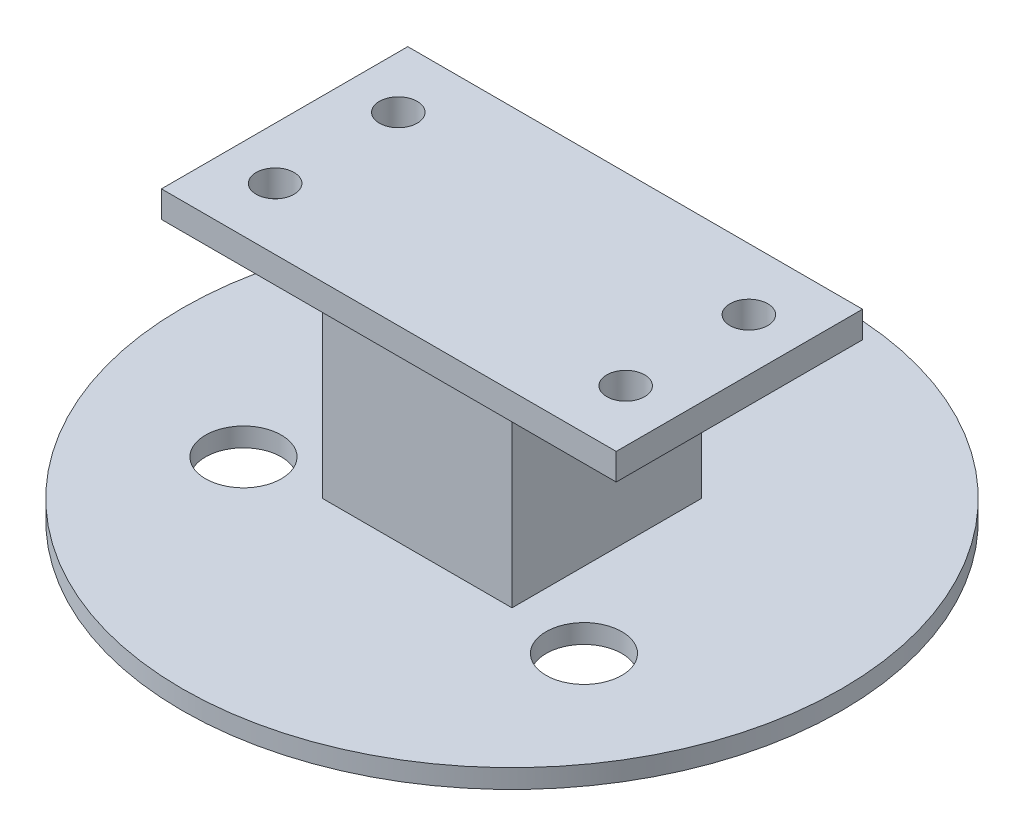
ISO-10303-21;
HEADER;
FILE_DESCRIPTION(('STEP AP214'),'2;1');
FILE_NAME('part.step','',(''),(''),'','','');
FILE_SCHEMA(('AUTOMOTIVE_DESIGN { 1 0 10303 214 1 1 1 1 }'));
ENDSEC;
DATA;
#1=APPLICATION_CONTEXT('core data for automotive mechanical design processes');
#2=APPLICATION_PROTOCOL_DEFINITION('international standard','automotive_design',2000,#1);
#3=PRODUCT_CONTEXT('',#1,'mechanical');
#4=PRODUCT('Part','Part','',(#3));
#5=PRODUCT_RELATED_PRODUCT_CATEGORY('part','',(#4));
#6=PRODUCT_DEFINITION_FORMATION('','',#4);
#7=PRODUCT_DEFINITION_CONTEXT('part definition',#1,'design');
#8=PRODUCT_DEFINITION('design','',#6,#7);
#9=PRODUCT_DEFINITION_SHAPE('','',#8);
#10=(LENGTH_UNIT() NAMED_UNIT(*) SI_UNIT(.MILLI.,.METRE.));
#11=(NAMED_UNIT(*) PLANE_ANGLE_UNIT() SI_UNIT($,.RADIAN.));
#12=(NAMED_UNIT(*) SI_UNIT($,.STERADIAN.) SOLID_ANGLE_UNIT());
#13=UNCERTAINTY_MEASURE_WITH_UNIT(LENGTH_MEASURE(1.E-05),#10,'distance_accuracy_value','');
#14=(GEOMETRIC_REPRESENTATION_CONTEXT(3) GLOBAL_UNCERTAINTY_ASSIGNED_CONTEXT((#13)) GLOBAL_UNIT_ASSIGNED_CONTEXT((#10,
#11,#12)) REPRESENTATION_CONTEXT('',''));
#15=CARTESIAN_POINT('',(0.,0.,0.));
#16=DIRECTION('',(0.,0.,1.));
#17=DIRECTION('',(1.,0.,0.));
#18=AXIS2_PLACEMENT_3D('',#15,#16,#17);
#19=CARTESIAN_POINT('',(0.,5.,0.));
#20=DIRECTION('',(0.,1.,0.));
#21=DIRECTION('',(0.,0.,1.));
#22=AXIS2_PLACEMENT_3D('',#19,#20,#21);
#23=PLANE('',#22);
#24=DIRECTION('',(0.,0.,-1.));
#25=VECTOR('',#24,1.);
#26=CARTESIAN_POINT('',(25.,5.,-25.));
#27=LINE('',#26,#25);
#28=CARTESIAN_POINT('',(25.,5.,25.));
#29=VERTEX_POINT('',#28);
#30=CARTESIAN_POINT('',(25.,5.,-25.));
#31=VERTEX_POINT('',#30);
#32=EDGE_CURVE('E55',#29,#31,#27,.T.);
#33=ORIENTED_EDGE('',*,*,#32,.F.);
#34=DIRECTION('',(1.,0.,0.));
#35=VECTOR('',#34,1.);
#36=CARTESIAN_POINT('',(-25.,5.,25.));
#37=LINE('',#36,#35);
#38=CARTESIAN_POINT('',(-25.,5.,25.));
#39=VERTEX_POINT('',#38);
#40=EDGE_CURVE('E59',#39,#29,#37,.T.);
#41=ORIENTED_EDGE('',*,*,#40,.F.);
#42=DIRECTION('',(0.,0.,1.));
#43=VECTOR('',#42,1.);
#44=CARTESIAN_POINT('',(-25.,5.,-25.));
#45=LINE('',#44,#43);
#46=CARTESIAN_POINT('',(-25.,5.,-25.));
#47=VERTEX_POINT('',#46);
#48=EDGE_CURVE('E151',#47,#39,#45,.T.);
#49=ORIENTED_EDGE('',*,*,#48,.F.);
#50=DIRECTION('',(-1.,0.,0.));
#51=VECTOR('',#50,1.);
#52=CARTESIAN_POINT('',(-25.,5.,-25.));
#53=LINE('',#52,#51);
#54=EDGE_CURVE('E130',#31,#47,#53,.T.);
#55=ORIENTED_EDGE('',*,*,#54,.F.);
#56=EDGE_LOOP('',(#33,#41,#49,#55));
#57=FACE_BOUND('',#56,.T.);
#58=CARTESIAN_POINT('',(44.9265678213211,5.,25.9366339745943));
#59=DIRECTION('',(0.,1.,0.));
#60=DIRECTION('',(0.,0.,1.));
#61=AXIS2_PLACEMENT_3D('',#58,#59,#60);
#62=CIRCLE('',#61,10.);
#63=CARTESIAN_POINT('',(44.9265678213211,5.,35.9366339745943));
#64=VERTEX_POINT('',#63);
#65=EDGE_CURVE('E172',#64,#64,#62,.T.);
#66=ORIENTED_EDGE('',*,*,#65,.F.);
#67=EDGE_LOOP('',(#66));
#68=FACE_BOUND('',#67,.T.);
#69=CARTESIAN_POINT('',(0.,5.,0.));
#70=DIRECTION('',(0.,1.,0.));
#71=DIRECTION('',(0.,0.,1.));
#72=AXIS2_PLACEMENT_3D('',#69,#70,#71);
#73=CIRCLE('',#72,87.);
#74=CARTESIAN_POINT('',(0.,5.,87.));
#75=VERTEX_POINT('',#74);
#76=EDGE_CURVE('E11',#75,#75,#73,.T.);
#77=ORIENTED_EDGE('',*,*,#76,.T.);
#78=EDGE_LOOP('',(#77));
#79=FACE_BOUND('',#78,.T.);
#80=CARTESIAN_POINT('',(0.,5.,-51.875));
#81=DIRECTION('',(0.,1.,0.));
#82=DIRECTION('',(0.,0.,1.));
#83=AXIS2_PLACEMENT_3D('',#80,#81,#82);
#84=CIRCLE('',#83,10.);
#85=CARTESIAN_POINT('',(0.,5.,-41.875));
#86=VERTEX_POINT('',#85);
#87=EDGE_CURVE('E178',#86,#86,#84,.T.);
#88=ORIENTED_EDGE('',*,*,#87,.F.);
#89=EDGE_LOOP('',(#88));
#90=FACE_BOUND('',#89,.T.);
#91=CARTESIAN_POINT('',(-44.9235678213145,5.,25.9383660254057));
#92=DIRECTION('',(0.,1.,0.));
#93=DIRECTION('',(0.,0.,1.));
#94=AXIS2_PLACEMENT_3D('',#91,#92,#93);
#95=CIRCLE('',#94,9.99999999999999);
#96=CARTESIAN_POINT('',(-44.9235678213145,5.,35.9383660254057));
#97=VERTEX_POINT('',#96);
#98=EDGE_CURVE('E166',#97,#97,#95,.T.);
#99=ORIENTED_EDGE('',*,*,#98,.F.);
#100=EDGE_LOOP('',(#99));
#101=FACE_BOUND('',#100,.T.);
#102=ADVANCED_FACE('F40',(#57,#68,#79,#90,#101),#23,.T.);
#103=CARTESIAN_POINT('',(0.,0.,0.));
#104=DIRECTION('',(0.,1.,0.));
#105=DIRECTION('',(0.,0.,1.));
#106=AXIS2_PLACEMENT_3D('',#103,#104,#105);
#107=PLANE('',#106);
#108=CARTESIAN_POINT('',(0.,0.,0.));
#109=DIRECTION('',(0.,1.,0.));
#110=DIRECTION('',(0.,0.,1.));
#111=AXIS2_PLACEMENT_3D('',#108,#109,#110);
#112=CIRCLE('',#111,87.);
#113=CARTESIAN_POINT('',(0.,0.,87.));
#114=VERTEX_POINT('',#113);
#115=EDGE_CURVE('E44',#114,#114,#112,.T.);
#116=ORIENTED_EDGE('',*,*,#115,.F.);
#117=EDGE_LOOP('',(#116));
#118=FACE_BOUND('',#117,.T.);
#119=CARTESIAN_POINT('',(0.,0.,-51.875));
#120=DIRECTION('',(0.,1.,0.));
#121=DIRECTION('',(0.,0.,1.));
#122=AXIS2_PLACEMENT_3D('',#119,#120,#121);
#123=CIRCLE('',#122,10.);
#124=CARTESIAN_POINT('',(0.,0.,-41.875));
#125=VERTEX_POINT('',#124);
#126=EDGE_CURVE('E175',#125,#125,#123,.T.);
#127=ORIENTED_EDGE('',*,*,#126,.T.);
#128=EDGE_LOOP('',(#127));
#129=FACE_BOUND('',#128,.T.);
#130=CARTESIAN_POINT('',(44.9265678213211,0.,25.9366339745943));
#131=DIRECTION('',(0.,1.,0.));
#132=DIRECTION('',(0.,0.,1.));
#133=AXIS2_PLACEMENT_3D('',#130,#131,#132);
#134=CIRCLE('',#133,10.);
#135=CARTESIAN_POINT('',(44.9265678213211,0.,35.9366339745943));
#136=VERTEX_POINT('',#135);
#137=EDGE_CURVE('E169',#136,#136,#134,.T.);
#138=ORIENTED_EDGE('',*,*,#137,.T.);
#139=EDGE_LOOP('',(#138));
#140=FACE_BOUND('',#139,.T.);
#141=CARTESIAN_POINT('',(-44.9235678213145,0.,25.9383660254057));
#142=DIRECTION('',(0.,1.,0.));
#143=DIRECTION('',(0.,0.,1.));
#144=AXIS2_PLACEMENT_3D('',#141,#142,#143);
#145=CIRCLE('',#144,9.99999999999999);
#146=CARTESIAN_POINT('',(-44.9235678213145,0.,35.9383660254057));
#147=VERTEX_POINT('',#146);
#148=EDGE_CURVE('E165',#147,#147,#145,.T.);
#149=ORIENTED_EDGE('',*,*,#148,.T.);
#150=EDGE_LOOP('',(#149));
#151=FACE_BOUND('',#150,.T.);
#152=ADVANCED_FACE('F184',(#118,#129,#140,#151),#107,.F.);
#153=CARTESIAN_POINT('',(0.,5.,0.));
#154=DIRECTION('',(0.,-1.,0.));
#155=DIRECTION('',(0.,0.,-1.));
#156=AXIS2_PLACEMENT_3D('',#153,#154,#155);
#157=CYLINDRICAL_SURFACE('',#156,87.);
#158=ORIENTED_EDGE('',*,*,#76,.F.);
#159=EDGE_LOOP('',(#158));
#160=FACE_BOUND('',#159,.T.);
#161=ORIENTED_EDGE('',*,*,#115,.T.);
#162=EDGE_LOOP('',(#161));
#163=FACE_BOUND('',#162,.T.);
#164=ADVANCED_FACE('F42',(#160,#163),#157,.T.);
#165=CARTESIAN_POINT('',(0.,5.,-51.875));
#166=DIRECTION('',(0.,-1.,0.));
#167=DIRECTION('',(0.,0.,-1.));
#168=AXIS2_PLACEMENT_3D('',#165,#166,#167);
#169=CYLINDRICAL_SURFACE('',#168,10.);
#170=ORIENTED_EDGE('',*,*,#87,.T.);
#171=EDGE_LOOP('',(#170));
#172=FACE_BOUND('',#171,.T.);
#173=ORIENTED_EDGE('',*,*,#126,.F.);
#174=EDGE_LOOP('',(#173));
#175=FACE_BOUND('',#174,.T.);
#176=ADVANCED_FACE('F187',(#172,#175),#169,.F.);
#177=CARTESIAN_POINT('',(44.9265678213211,5.,25.9366339745943));
#178=DIRECTION('',(0.,-1.,0.));
#179=DIRECTION('',(0.,0.,-1.));
#180=AXIS2_PLACEMENT_3D('',#177,#178,#179);
#181=CYLINDRICAL_SURFACE('',#180,10.);
#182=ORIENTED_EDGE('',*,*,#65,.T.);
#183=EDGE_LOOP('',(#182));
#184=FACE_BOUND('',#183,.T.);
#185=ORIENTED_EDGE('',*,*,#137,.F.);
#186=EDGE_LOOP('',(#185));
#187=FACE_BOUND('',#186,.T.);
#188=ADVANCED_FACE('F189',(#184,#187),#181,.F.);
#189=CARTESIAN_POINT('',(-44.9235678213145,5.,25.9383660254057));
#190=DIRECTION('',(0.,-1.,0.));
#191=DIRECTION('',(0.,0.,-1.));
#192=AXIS2_PLACEMENT_3D('',#189,#190,#191);
#193=CYLINDRICAL_SURFACE('',#192,9.99999999999999);
#194=ORIENTED_EDGE('',*,*,#98,.T.);
#195=EDGE_LOOP('',(#194));
#196=FACE_BOUND('',#195,.T.);
#197=ORIENTED_EDGE('',*,*,#148,.F.);
#198=EDGE_LOOP('',(#197));
#199=FACE_BOUND('',#198,.T.);
#200=ADVANCED_FACE('F196',(#196,#199),#193,.F.);
#201=CARTESIAN_POINT('',(25.,55.,-25.));
#202=DIRECTION('',(-1.,0.,0.));
#203=DIRECTION('',(0.,0.,1.));
#204=AXIS2_PLACEMENT_3D('',#201,#202,#203);
#205=PLANE('',#204);
#206=ORIENTED_EDGE('',*,*,#32,.T.);
#207=DIRECTION('',(0.,-1.,0.));
#208=VECTOR('',#207,1.);
#209=CARTESIAN_POINT('',(25.,55.,-25.));
#210=LINE('',#209,#208);
#211=CARTESIAN_POINT('',(25.,55.,-25.));
#212=VERTEX_POINT('',#211);
#213=EDGE_CURVE('E162',#212,#31,#210,.T.);
#214=ORIENTED_EDGE('',*,*,#213,.F.);
#215=DIRECTION('',(0.,0.,-1.));
#216=VECTOR('',#215,1.);
#217=CARTESIAN_POINT('',(25.,55.,-25.));
#218=LINE('',#217,#216);
#219=CARTESIAN_POINT('',(25.,55.,25.));
#220=VERTEX_POINT('',#219);
#221=EDGE_CURVE('E136',#220,#212,#218,.T.);
#222=ORIENTED_EDGE('',*,*,#221,.F.);
#223=DIRECTION('',(0.,-1.,0.));
#224=VECTOR('',#223,1.);
#225=CARTESIAN_POINT('',(25.,55.,25.));
#226=LINE('',#225,#224);
#227=EDGE_CURVE('E147',#220,#29,#226,.T.);
#228=ORIENTED_EDGE('',*,*,#227,.T.);
#229=EDGE_LOOP('',(#206,#214,#222,#228));
#230=FACE_BOUND('',#229,.T.);
#231=ADVANCED_FACE('F217',(#230),#205,.F.);
#232=CARTESIAN_POINT('',(-25.,55.,-25.));
#233=DIRECTION('',(0.,0.,1.));
#234=DIRECTION('',(1.,0.,0.));
#235=AXIS2_PLACEMENT_3D('',#232,#233,#234);
#236=PLANE('',#235);
#237=ORIENTED_EDGE('',*,*,#54,.T.);
#238=DIRECTION('',(0.,-1.,0.));
#239=VECTOR('',#238,1.);
#240=CARTESIAN_POINT('',(-25.,55.,-25.));
#241=LINE('',#240,#239);
#242=CARTESIAN_POINT('',(-25.,55.,-25.));
#243=VERTEX_POINT('',#242);
#244=EDGE_CURVE('E159',#243,#47,#241,.T.);
#245=ORIENTED_EDGE('',*,*,#244,.F.);
#246=DIRECTION('',(-1.,0.,0.));
#247=VECTOR('',#246,1.);
#248=CARTESIAN_POINT('',(-25.,55.,-25.));
#249=LINE('',#248,#247);
#250=EDGE_CURVE('E139',#212,#243,#249,.T.);
#251=ORIENTED_EDGE('',*,*,#250,.F.);
#252=ORIENTED_EDGE('',*,*,#213,.T.);
#253=EDGE_LOOP('',(#237,#245,#251,#252));
#254=FACE_BOUND('',#253,.T.);
#255=ADVANCED_FACE('F224',(#254),#236,.F.);
#256=CARTESIAN_POINT('',(-25.,55.,-25.));
#257=DIRECTION('',(1.,0.,0.));
#258=DIRECTION('',(0.,0.,-1.));
#259=AXIS2_PLACEMENT_3D('',#256,#257,#258);
#260=PLANE('',#259);
#261=ORIENTED_EDGE('',*,*,#48,.T.);
#262=DIRECTION('',(0.,-1.,0.));
#263=VECTOR('',#262,1.);
#264=CARTESIAN_POINT('',(-25.,55.,25.));
#265=LINE('',#264,#263);
#266=CARTESIAN_POINT('',(-25.,55.,25.));
#267=VERTEX_POINT('',#266);
#268=EDGE_CURVE('E156',#267,#39,#265,.T.);
#269=ORIENTED_EDGE('',*,*,#268,.F.);
#270=DIRECTION('',(0.,0.,1.));
#271=VECTOR('',#270,1.);
#272=CARTESIAN_POINT('',(-25.,55.,-25.));
#273=LINE('',#272,#271);
#274=EDGE_CURVE('E142',#243,#267,#273,.T.);
#275=ORIENTED_EDGE('',*,*,#274,.F.);
#276=ORIENTED_EDGE('',*,*,#244,.T.);
#277=EDGE_LOOP('',(#261,#269,#275,#276));
#278=FACE_BOUND('',#277,.T.);
#279=ADVANCED_FACE('F230',(#278),#260,.F.);
#280=CARTESIAN_POINT('',(-25.,55.,25.));
#281=DIRECTION('',(0.,0.,-1.));
#282=DIRECTION('',(-1.,0.,0.));
#283=AXIS2_PLACEMENT_3D('',#280,#281,#282);
#284=PLANE('',#283);
#285=ORIENTED_EDGE('',*,*,#40,.T.);
#286=ORIENTED_EDGE('',*,*,#227,.F.);
#287=DIRECTION('',(1.,0.,0.));
#288=VECTOR('',#287,1.);
#289=CARTESIAN_POINT('',(-25.,55.,25.));
#290=LINE('',#289,#288);
#291=EDGE_CURVE('E145',#267,#220,#290,.T.);
#292=ORIENTED_EDGE('',*,*,#291,.F.);
#293=ORIENTED_EDGE('',*,*,#268,.T.);
#294=EDGE_LOOP('',(#285,#286,#292,#293));
#295=FACE_BOUND('',#294,.T.);
#296=ADVANCED_FACE('F234',(#295),#284,.F.);
#297=CARTESIAN_POINT('',(0.,55.,0.));
#298=DIRECTION('',(0.,1.,0.));
#299=DIRECTION('',(0.,0.,1.));
#300=AXIS2_PLACEMENT_3D('',#297,#298,#299);
#301=PLANE('',#300);
#302=DIRECTION('',(0.,0.,-1.));
#303=VECTOR('',#302,1.);
#304=CARTESIAN_POINT('',(60.,55.,-32.5));
#305=LINE('',#304,#303);
#306=CARTESIAN_POINT('',(60.,55.,32.5));
#307=VERTEX_POINT('',#306);
#308=CARTESIAN_POINT('',(60.,55.,-32.5));
#309=VERTEX_POINT('',#308);
#310=EDGE_CURVE('E128',#307,#309,#305,.T.);
#311=ORIENTED_EDGE('',*,*,#310,.F.);
#312=DIRECTION('',(1.,0.,0.));
#313=VECTOR('',#312,1.);
#314=CARTESIAN_POINT('',(-60.,55.,32.5));
#315=LINE('',#314,#313);
#316=CARTESIAN_POINT('',(-60.,55.,32.5));
#317=VERTEX_POINT('',#316);
#318=EDGE_CURVE('E124',#317,#307,#315,.T.);
#319=ORIENTED_EDGE('',*,*,#318,.F.);
#320=DIRECTION('',(0.,0.,1.));
#321=VECTOR('',#320,1.);
#322=CARTESIAN_POINT('',(-60.,55.,-32.5));
#323=LINE('',#322,#321);
#324=CARTESIAN_POINT('',(-60.,55.,-32.5));
#325=VERTEX_POINT('',#324);
#326=EDGE_CURVE('E310',#325,#317,#323,.T.);
#327=ORIENTED_EDGE('',*,*,#326,.F.);
#328=DIRECTION('',(-1.,0.,0.));
#329=VECTOR('',#328,1.);
#330=CARTESIAN_POINT('',(-60.,55.,-32.5));
#331=LINE('',#330,#329);
#332=EDGE_CURVE('E308',#309,#325,#331,.T.);
#333=ORIENTED_EDGE('',*,*,#332,.F.);
#334=EDGE_LOOP('',(#311,#319,#327,#333));
#335=FACE_BOUND('',#334,.T.);
#336=CARTESIAN_POINT('',(-46.25,55.,16.25));
#337=DIRECTION('',(0.,1.,0.));
#338=DIRECTION('',(0.,0.,1.));
#339=AXIS2_PLACEMENT_3D('',#336,#337,#338);
#340=CIRCLE('',#339,5.);
#341=CARTESIAN_POINT('',(-46.25,55.,21.25));
#342=VERTEX_POINT('',#341);
#343=EDGE_CURVE('E296',#342,#342,#340,.T.);
#344=ORIENTED_EDGE('',*,*,#343,.T.);
#345=EDGE_LOOP('',(#344));
#346=FACE_BOUND('',#345,.T.);
#347=CARTESIAN_POINT('',(-46.25,55.,-16.25));
#348=DIRECTION('',(0.,1.,0.));
#349=DIRECTION('',(0.,0.,-1.));
#350=AXIS2_PLACEMENT_3D('',#347,#348,#349);
#351=CIRCLE('',#350,4.99999999999998);
#352=CARTESIAN_POINT('',(-46.25,55.,-21.25));
#353=VERTEX_POINT('',#352);
#354=EDGE_CURVE('E290',#353,#353,#351,.T.);
#355=ORIENTED_EDGE('',*,*,#354,.T.);
#356=EDGE_LOOP('',(#355));
#357=FACE_BOUND('',#356,.T.);
#358=CARTESIAN_POINT('',(46.25,55.,16.25));
#359=DIRECTION('',(0.,1.,0.));
#360=DIRECTION('',(0.,0.,-1.));
#361=AXIS2_PLACEMENT_3D('',#358,#359,#360);
#362=CIRCLE('',#361,4.99999999999999);
#363=CARTESIAN_POINT('',(46.25,55.,11.25));
#364=VERTEX_POINT('',#363);
#365=EDGE_CURVE('E284',#364,#364,#362,.T.);
#366=ORIENTED_EDGE('',*,*,#365,.T.);
#367=EDGE_LOOP('',(#366));
#368=FACE_BOUND('',#367,.T.);
#369=CARTESIAN_POINT('',(46.25,55.,-16.25));
#370=DIRECTION('',(0.,1.,0.));
#371=DIRECTION('',(0.,0.,1.));
#372=AXIS2_PLACEMENT_3D('',#369,#370,#371);
#373=CIRCLE('',#372,4.99999999999998);
#374=CARTESIAN_POINT('',(46.25,55.,-11.2500000000001));
#375=VERTEX_POINT('',#374);
#376=EDGE_CURVE('E281',#375,#375,#373,.T.);
#377=ORIENTED_EDGE('',*,*,#376,.T.);
#378=EDGE_LOOP('',(#377));
#379=FACE_BOUND('',#378,.T.);
#380=ORIENTED_EDGE('',*,*,#291,.T.);
#381=ORIENTED_EDGE('',*,*,#221,.T.);
#382=ORIENTED_EDGE('',*,*,#250,.T.);
#383=ORIENTED_EDGE('',*,*,#274,.T.);
#384=EDGE_LOOP('',(#380,#381,#382,#383));
#385=FACE_BOUND('',#384,.T.);
#386=ADVANCED_FACE('F238',(#335,#346,#357,#368,#379,#385),#301,.F.);
#387=CARTESIAN_POINT('',(0.,62.,0.));
#388=DIRECTION('',(0.,1.,0.));
#389=DIRECTION('',(0.,0.,1.));
#390=AXIS2_PLACEMENT_3D('',#387,#388,#389);
#391=PLANE('',#390);
#392=CARTESIAN_POINT('',(46.25,62.,16.25));
#393=DIRECTION('',(0.,1.,0.));
#394=DIRECTION('',(0.,0.,-1.));
#395=AXIS2_PLACEMENT_3D('',#392,#393,#394);
#396=CIRCLE('',#395,4.99999999999999);
#397=CARTESIAN_POINT('',(46.25,62.,11.25));
#398=VERTEX_POINT('',#397);
#399=EDGE_CURVE('E287',#398,#398,#396,.T.);
#400=ORIENTED_EDGE('',*,*,#399,.F.);
#401=EDGE_LOOP('',(#400));
#402=FACE_BOUND('',#401,.T.);
#403=CARTESIAN_POINT('',(-46.25,62.,16.25));
#404=DIRECTION('',(0.,1.,0.));
#405=DIRECTION('',(0.,0.,1.));
#406=AXIS2_PLACEMENT_3D('',#403,#404,#405);
#407=CIRCLE('',#406,5.);
#408=CARTESIAN_POINT('',(-46.25,62.,21.25));
#409=VERTEX_POINT('',#408);
#410=EDGE_CURVE('E299',#409,#409,#407,.T.);
#411=ORIENTED_EDGE('',*,*,#410,.F.);
#412=EDGE_LOOP('',(#411));
#413=FACE_BOUND('',#412,.T.);
#414=DIRECTION('',(0.,0.,-1.));
#415=VECTOR('',#414,1.);
#416=CARTESIAN_POINT('',(60.,62.,-32.5));
#417=LINE('',#416,#415);
#418=CARTESIAN_POINT('',(60.,62.,32.5));
#419=VERTEX_POINT('',#418);
#420=CARTESIAN_POINT('',(60.,62.,-32.5));
#421=VERTEX_POINT('',#420);
#422=EDGE_CURVE('E114',#419,#421,#417,.T.);
#423=ORIENTED_EDGE('',*,*,#422,.T.);
#424=DIRECTION('',(-1.,0.,0.));
#425=VECTOR('',#424,1.);
#426=CARTESIAN_POINT('',(-60.,62.,-32.5));
#427=LINE('',#426,#425);
#428=CARTESIAN_POINT('',(-60.,62.,-32.5));
#429=VERTEX_POINT('',#428);
#430=EDGE_CURVE('E103',#421,#429,#427,.T.);
#431=ORIENTED_EDGE('',*,*,#430,.T.);
#432=DIRECTION('',(0.,0.,1.));
#433=VECTOR('',#432,1.);
#434=CARTESIAN_POINT('',(-60.,62.,-32.5));
#435=LINE('',#434,#433);
#436=CARTESIAN_POINT('',(-60.,62.,32.5));
#437=VERTEX_POINT('',#436);
#438=EDGE_CURVE('E113',#429,#437,#435,.T.);
#439=ORIENTED_EDGE('',*,*,#438,.T.);
#440=DIRECTION('',(1.,0.,0.));
#441=VECTOR('',#440,1.);
#442=CARTESIAN_POINT('',(-60.,62.,32.5));
#443=LINE('',#442,#441);
#444=EDGE_CURVE('E120',#437,#419,#443,.T.);
#445=ORIENTED_EDGE('',*,*,#444,.T.);
#446=EDGE_LOOP('',(#423,#431,#439,#445));
#447=FACE_BOUND('',#446,.T.);
#448=CARTESIAN_POINT('',(-46.25,62.,-16.25));
#449=DIRECTION('',(0.,1.,0.));
#450=DIRECTION('',(0.,0.,-1.));
#451=AXIS2_PLACEMENT_3D('',#448,#449,#450);
#452=CIRCLE('',#451,4.99999999999998);
#453=CARTESIAN_POINT('',(-46.25,62.,-21.25));
#454=VERTEX_POINT('',#453);
#455=EDGE_CURVE('E293',#454,#454,#452,.T.);
#456=ORIENTED_EDGE('',*,*,#455,.F.);
#457=EDGE_LOOP('',(#456));
#458=FACE_BOUND('',#457,.T.);
#459=CARTESIAN_POINT('',(46.25,62.,-16.25));
#460=DIRECTION('',(0.,1.,0.));
#461=DIRECTION('',(0.,0.,1.));
#462=AXIS2_PLACEMENT_3D('',#459,#460,#461);
#463=CIRCLE('',#462,4.99999999999998);
#464=CARTESIAN_POINT('',(46.25,62.,-11.2500000000001));
#465=VERTEX_POINT('',#464);
#466=EDGE_CURVE('E278',#465,#465,#463,.T.);
#467=ORIENTED_EDGE('',*,*,#466,.F.);
#468=EDGE_LOOP('',(#467));
#469=FACE_BOUND('',#468,.T.);
#470=ADVANCED_FACE('F117',(#402,#413,#447,#458,#469),#391,.T.);
#471=CARTESIAN_POINT('',(60.,62.,-32.5));
#472=DIRECTION('',(-1.,0.,0.));
#473=DIRECTION('',(0.,0.,1.));
#474=AXIS2_PLACEMENT_3D('',#471,#472,#473);
#475=PLANE('',#474);
#476=ORIENTED_EDGE('',*,*,#310,.T.);
#477=DIRECTION('',(0.,-1.,0.));
#478=VECTOR('',#477,1.);
#479=CARTESIAN_POINT('',(60.,62.,-32.5));
#480=LINE('',#479,#478);
#481=EDGE_CURVE('E107',#421,#309,#480,.T.);
#482=ORIENTED_EDGE('',*,*,#481,.F.);
#483=ORIENTED_EDGE('',*,*,#422,.F.);
#484=DIRECTION('',(0.,-1.,0.));
#485=VECTOR('',#484,1.);
#486=CARTESIAN_POINT('',(60.,62.,32.5));
#487=LINE('',#486,#485);
#488=EDGE_CURVE('E306',#419,#307,#487,.T.);
#489=ORIENTED_EDGE('',*,*,#488,.T.);
#490=EDGE_LOOP('',(#476,#482,#483,#489));
#491=FACE_BOUND('',#490,.T.);
#492=ADVANCED_FACE('F126',(#491),#475,.F.);
#493=CARTESIAN_POINT('',(-60.,62.,-32.5));
#494=DIRECTION('',(0.,0.,1.));
#495=DIRECTION('',(1.,0.,0.));
#496=AXIS2_PLACEMENT_3D('',#493,#494,#495);
#497=PLANE('',#496);
#498=ORIENTED_EDGE('',*,*,#332,.T.);
#499=DIRECTION('',(0.,-1.,0.));
#500=VECTOR('',#499,1.);
#501=CARTESIAN_POINT('',(-60.,62.,-32.5));
#502=LINE('',#501,#500);
#503=EDGE_CURVE('E110',#429,#325,#502,.T.);
#504=ORIENTED_EDGE('',*,*,#503,.F.);
#505=ORIENTED_EDGE('',*,*,#430,.F.);
#506=ORIENTED_EDGE('',*,*,#481,.T.);
#507=EDGE_LOOP('',(#498,#504,#505,#506));
#508=FACE_BOUND('',#507,.T.);
#509=ADVANCED_FACE('F105',(#508),#497,.F.);
#510=CARTESIAN_POINT('',(-60.,62.,-32.5));
#511=DIRECTION('',(1.,0.,0.));
#512=DIRECTION('',(0.,0.,-1.));
#513=AXIS2_PLACEMENT_3D('',#510,#511,#512);
#514=PLANE('',#513);
#515=ORIENTED_EDGE('',*,*,#326,.T.);
#516=DIRECTION('',(0.,-1.,0.));
#517=VECTOR('',#516,1.);
#518=CARTESIAN_POINT('',(-60.,62.,32.5));
#519=LINE('',#518,#517);
#520=EDGE_CURVE('E132',#437,#317,#519,.T.);
#521=ORIENTED_EDGE('',*,*,#520,.F.);
#522=ORIENTED_EDGE('',*,*,#438,.F.);
#523=ORIENTED_EDGE('',*,*,#503,.T.);
#524=EDGE_LOOP('',(#515,#521,#522,#523));
#525=FACE_BOUND('',#524,.T.);
#526=ADVANCED_FACE('F244',(#525),#514,.F.);
#527=CARTESIAN_POINT('',(-60.,62.,32.5));
#528=DIRECTION('',(0.,0.,-1.));
#529=DIRECTION('',(-1.,0.,0.));
#530=AXIS2_PLACEMENT_3D('',#527,#528,#529);
#531=PLANE('',#530);
#532=ORIENTED_EDGE('',*,*,#318,.T.);
#533=ORIENTED_EDGE('',*,*,#488,.F.);
#534=ORIENTED_EDGE('',*,*,#444,.F.);
#535=ORIENTED_EDGE('',*,*,#520,.T.);
#536=EDGE_LOOP('',(#532,#533,#534,#535));
#537=FACE_BOUND('',#536,.T.);
#538=ADVANCED_FACE('F247',(#537),#531,.F.);
#539=CARTESIAN_POINT('',(-46.25,62.,16.25));
#540=DIRECTION('',(0.,-1.,0.));
#541=DIRECTION('',(0.,0.,-1.));
#542=AXIS2_PLACEMENT_3D('',#539,#540,#541);
#543=CYLINDRICAL_SURFACE('',#542,5.);
#544=ORIENTED_EDGE('',*,*,#410,.T.);
#545=EDGE_LOOP('',(#544));
#546=FACE_BOUND('',#545,.T.);
#547=ORIENTED_EDGE('',*,*,#343,.F.);
#548=EDGE_LOOP('',(#547));
#549=FACE_BOUND('',#548,.T.);
#550=ADVANCED_FACE('F251',(#546,#549),#543,.F.);
#551=CARTESIAN_POINT('',(-46.25,62.,-16.25));
#552=DIRECTION('',(0.,-1.,0.));
#553=DIRECTION('',(0.,0.,-1.));
#554=AXIS2_PLACEMENT_3D('',#551,#552,#553);
#555=CYLINDRICAL_SURFACE('',#554,4.99999999999998);
#556=ORIENTED_EDGE('',*,*,#455,.T.);
#557=EDGE_LOOP('',(#556));
#558=FACE_BOUND('',#557,.T.);
#559=ORIENTED_EDGE('',*,*,#354,.F.);
#560=EDGE_LOOP('',(#559));
#561=FACE_BOUND('',#560,.T.);
#562=ADVANCED_FACE('F261',(#558,#561),#555,.F.);
#563=CARTESIAN_POINT('',(46.25,62.,16.25));
#564=DIRECTION('',(0.,-1.,0.));
#565=DIRECTION('',(0.,0.,-1.));
#566=AXIS2_PLACEMENT_3D('',#563,#564,#565);
#567=CYLINDRICAL_SURFACE('',#566,4.99999999999999);
#568=ORIENTED_EDGE('',*,*,#399,.T.);
#569=EDGE_LOOP('',(#568));
#570=FACE_BOUND('',#569,.T.);
#571=ORIENTED_EDGE('',*,*,#365,.F.);
#572=EDGE_LOOP('',(#571));
#573=FACE_BOUND('',#572,.T.);
#574=ADVANCED_FACE('F265',(#570,#573),#567,.F.);
#575=CARTESIAN_POINT('',(46.25,62.,-16.25));
#576=DIRECTION('',(0.,-1.,0.));
#577=DIRECTION('',(0.,0.,-1.));
#578=AXIS2_PLACEMENT_3D('',#575,#576,#577);
#579=CYLINDRICAL_SURFACE('',#578,4.99999999999998);
#580=ORIENTED_EDGE('',*,*,#466,.T.);
#581=EDGE_LOOP('',(#580));
#582=FACE_BOUND('',#581,.T.);
#583=ORIENTED_EDGE('',*,*,#376,.F.);
#584=EDGE_LOOP('',(#583));
#585=FACE_BOUND('',#584,.T.);
#586=ADVANCED_FACE('F269',(#582,#585),#579,.F.);
#587=CLOSED_SHELL('',(#102,#152,#164,#176,#188,#200,#231,#255,#279,#296,#386,#470,#492,#509,
#526,#538,#550,#562,#574,#586));
#588=MANIFOLD_SOLID_BREP('B2',#587);
#589=ADVANCED_BREP_SHAPE_REPRESENTATION('',(#18,#588),#14);
#590=SHAPE_DEFINITION_REPRESENTATION(#9,#589);
ENDSEC;
END-ISO-10303-21;
